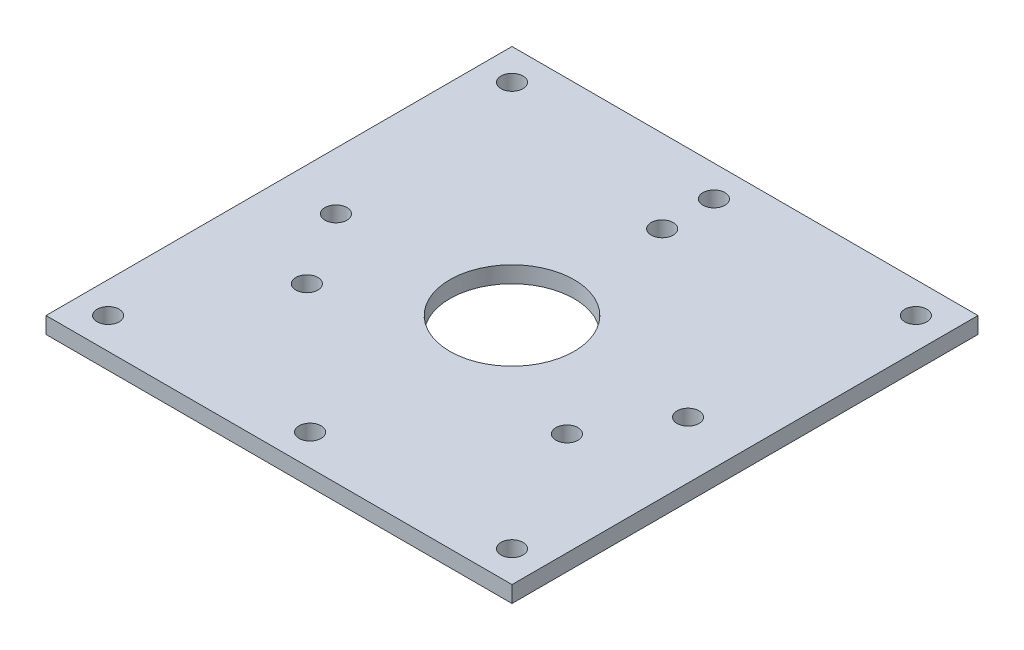
ISO-10303-21;
HEADER;
FILE_DESCRIPTION(('STEP AP214'),'2;1');
FILE_NAME('part.step','',(''),(''),'','','');
FILE_SCHEMA(('AUTOMOTIVE_DESIGN { 1 0 10303 214 1 1 1 1 }'));
ENDSEC;
DATA;
#1=APPLICATION_CONTEXT('core data for automotive mechanical design processes');
#2=APPLICATION_PROTOCOL_DEFINITION('international standard','automotive_design',2000,#1);
#3=PRODUCT_CONTEXT('',#1,'mechanical');
#4=PRODUCT('Part','Part','',(#3));
#5=PRODUCT_RELATED_PRODUCT_CATEGORY('part','',(#4));
#6=PRODUCT_DEFINITION_FORMATION('','',#4);
#7=PRODUCT_DEFINITION_CONTEXT('part definition',#1,'design');
#8=PRODUCT_DEFINITION('design','',#6,#7);
#9=PRODUCT_DEFINITION_SHAPE('','',#8);
#10=(LENGTH_UNIT() NAMED_UNIT(*) SI_UNIT(.MILLI.,.METRE.));
#11=(NAMED_UNIT(*) PLANE_ANGLE_UNIT() SI_UNIT($,.RADIAN.));
#12=(NAMED_UNIT(*) SI_UNIT($,.STERADIAN.) SOLID_ANGLE_UNIT());
#13=UNCERTAINTY_MEASURE_WITH_UNIT(LENGTH_MEASURE(1.E-05),#10,'distance_accuracy_value','');
#14=(GEOMETRIC_REPRESENTATION_CONTEXT(3) GLOBAL_UNCERTAINTY_ASSIGNED_CONTEXT((#13)) GLOBAL_UNIT_ASSIGNED_CONTEXT((#10,
#11,#12)) REPRESENTATION_CONTEXT('',''));
#15=CARTESIAN_POINT('',(0.,0.,0.));
#16=DIRECTION('',(0.,0.,1.));
#17=DIRECTION('',(1.,0.,0.));
#18=AXIS2_PLACEMENT_3D('',#15,#16,#17);
#19=CARTESIAN_POINT('',(0.,3.175,0.));
#20=DIRECTION('',(0.,-1.,0.));
#21=DIRECTION('',(0.,0.,-1.));
#22=AXIS2_PLACEMENT_3D('',#19,#20,#21);
#23=PLANE('',#22);
#24=DIRECTION('',(0.,0.,-1.));
#25=VECTOR('',#24,1.);
#26=CARTESIAN_POINT('',(45.,3.175,45.));
#27=LINE('',#26,#25);
#28=CARTESIAN_POINT('',(45.,3.175,45.));
#29=VERTEX_POINT('',#28);
#30=CARTESIAN_POINT('',(45.,3.175,-45.));
#31=VERTEX_POINT('',#30);
#32=EDGE_CURVE('E98',#29,#31,#27,.T.);
#33=ORIENTED_EDGE('',*,*,#32,.T.);
#34=DIRECTION('',(-1.,0.,0.));
#35=VECTOR('',#34,1.);
#36=CARTESIAN_POINT('',(-45.,3.175,-45.));
#37=LINE('',#36,#35);
#38=CARTESIAN_POINT('',(-45.,3.175,-45.));
#39=VERTEX_POINT('',#38);
#40=EDGE_CURVE('E93',#31,#39,#37,.T.);
#41=ORIENTED_EDGE('',*,*,#40,.T.);
#42=DIRECTION('',(0.,0.,1.));
#43=VECTOR('',#42,1.);
#44=CARTESIAN_POINT('',(-45.,3.175,45.));
#45=LINE('',#44,#43);
#46=CARTESIAN_POINT('',(-45.,3.175,45.));
#47=VERTEX_POINT('',#46);
#48=EDGE_CURVE('E96',#39,#47,#45,.T.);
#49=ORIENTED_EDGE('',*,*,#48,.T.);
#50=DIRECTION('',(1.,0.,0.));
#51=VECTOR('',#50,1.);
#52=CARTESIAN_POINT('',(-45.,3.175,45.));
#53=LINE('',#52,#51);
#54=EDGE_CURVE('E63',#47,#29,#53,.T.);
#55=ORIENTED_EDGE('',*,*,#54,.T.);
#56=EDGE_LOOP('',(#33,#41,#49,#55));
#57=FACE_BOUND('',#56,.T.);
#58=CARTESIAN_POINT('',(0.,3.175,0.));
#59=DIRECTION('',(0.,1.,0.));
#60=DIRECTION('',(0.,0.,1.));
#61=AXIS2_PLACEMENT_3D('',#58,#59,#60);
#62=CIRCLE('',#61,12.);
#63=CARTESIAN_POINT('',(0.,3.175,12.));
#64=VERTEX_POINT('',#63);
#65=EDGE_CURVE('E118',#64,#64,#62,.T.);
#66=ORIENTED_EDGE('',*,*,#65,.F.);
#67=EDGE_LOOP('',(#66));
#68=FACE_BOUND('',#67,.T.);
#69=CARTESIAN_POINT('',(0.,3.175,-29.));
#70=DIRECTION('',(0.,1.,0.));
#71=DIRECTION('',(0.,0.,1.));
#72=AXIS2_PLACEMENT_3D('',#69,#70,#71);
#73=CIRCLE('',#72,2.125);
#74=CARTESIAN_POINT('',(0.,3.175,-26.875));
#75=VERTEX_POINT('',#74);
#76=EDGE_CURVE('E140',#75,#75,#73,.T.);
#77=ORIENTED_EDGE('',*,*,#76,.F.);
#78=EDGE_LOOP('',(#77));
#79=FACE_BOUND('',#78,.T.);
#80=CARTESIAN_POINT('',(-39.,3.175,39.));
#81=DIRECTION('',(0.,1.,0.));
#82=DIRECTION('',(0.,0.,1.));
#83=AXIS2_PLACEMENT_3D('',#80,#81,#82);
#84=CIRCLE('',#83,2.125);
#85=CARTESIAN_POINT('',(-39.,3.175,41.125));
#86=VERTEX_POINT('',#85);
#87=EDGE_CURVE('E148',#86,#86,#84,.T.);
#88=ORIENTED_EDGE('',*,*,#87,.F.);
#89=EDGE_LOOP('',(#88));
#90=FACE_BOUND('',#89,.T.);
#91=CARTESIAN_POINT('',(25.1147367097506,3.175,14.4999999999989));
#92=DIRECTION('',(0.,1.,0.));
#93=DIRECTION('',(0.,0.,1.));
#94=AXIS2_PLACEMENT_3D('',#91,#92,#93);
#95=CIRCLE('',#94,2.12500000000159);
#96=CARTESIAN_POINT('',(25.1147367097506,3.175,16.6250000000005));
#97=VERTEX_POINT('',#96);
#98=EDGE_CURVE('E156',#97,#97,#95,.T.);
#99=ORIENTED_EDGE('',*,*,#98,.F.);
#100=EDGE_LOOP('',(#99));
#101=FACE_BOUND('',#100,.T.);
#102=CARTESIAN_POINT('',(-25.1147367097469,3.175,14.5000000000011));
#103=DIRECTION('',(0.,1.,0.));
#104=DIRECTION('',(0.,0.,1.));
#105=AXIS2_PLACEMENT_3D('',#102,#103,#104);
#106=CIRCLE('',#105,2.12500000000233);
#107=CARTESIAN_POINT('',(-25.1147367097469,3.175,16.6250000000034));
#108=VERTEX_POINT('',#107);
#109=EDGE_CURVE('E164',#108,#108,#106,.T.);
#110=ORIENTED_EDGE('',*,*,#109,.F.);
#111=EDGE_LOOP('',(#110));
#112=FACE_BOUND('',#111,.T.);
#113=CARTESIAN_POINT('',(-34.,3.175,0.));
#114=DIRECTION('',(0.,1.,0.));
#115=DIRECTION('',(0.,0.,1.));
#116=AXIS2_PLACEMENT_3D('',#113,#114,#115);
#117=CIRCLE('',#116,2.125);
#118=CARTESIAN_POINT('',(-34.,3.175,2.125));
#119=VERTEX_POINT('',#118);
#120=EDGE_CURVE('E172',#119,#119,#117,.T.);
#121=ORIENTED_EDGE('',*,*,#120,.F.);
#122=EDGE_LOOP('',(#121));
#123=FACE_BOUND('',#122,.T.);
#124=CARTESIAN_POINT('',(-39.,3.175,-39.));
#125=DIRECTION('',(0.,1.,0.));
#126=DIRECTION('',(0.,0.,-1.));
#127=AXIS2_PLACEMENT_3D('',#124,#125,#126);
#128=CIRCLE('',#127,2.125);
#129=CARTESIAN_POINT('',(-39.,3.175,-41.125));
#130=VERTEX_POINT('',#129);
#131=EDGE_CURVE('E180',#130,#130,#128,.T.);
#132=ORIENTED_EDGE('',*,*,#131,.F.);
#133=EDGE_LOOP('',(#132));
#134=FACE_BOUND('',#133,.T.);
#135=CARTESIAN_POINT('',(39.,3.175,39.));
#136=DIRECTION('',(0.,1.,0.));
#137=DIRECTION('',(0.,0.,-1.));
#138=AXIS2_PLACEMENT_3D('',#135,#136,#137);
#139=CIRCLE('',#138,2.125);
#140=CARTESIAN_POINT('',(39.,3.175,36.875));
#141=VERTEX_POINT('',#140);
#142=EDGE_CURVE('E188',#141,#141,#139,.T.);
#143=ORIENTED_EDGE('',*,*,#142,.F.);
#144=EDGE_LOOP('',(#143));
#145=FACE_BOUND('',#144,.T.);
#146=CARTESIAN_POINT('',(34.,3.175,0.));
#147=DIRECTION('',(0.,1.,0.));
#148=DIRECTION('',(0.,0.,-1.));
#149=AXIS2_PLACEMENT_3D('',#146,#147,#148);
#150=CIRCLE('',#149,2.125);
#151=CARTESIAN_POINT('',(34.,3.175,-2.125));
#152=VERTEX_POINT('',#151);
#153=EDGE_CURVE('E196',#152,#152,#150,.T.);
#154=ORIENTED_EDGE('',*,*,#153,.F.);
#155=EDGE_LOOP('',(#154));
#156=FACE_BOUND('',#155,.T.);
#157=CARTESIAN_POINT('',(39.,3.175,-39.));
#158=DIRECTION('',(0.,1.,0.));
#159=DIRECTION('',(0.,0.,1.));
#160=AXIS2_PLACEMENT_3D('',#157,#158,#159);
#161=CIRCLE('',#160,2.125);
#162=CARTESIAN_POINT('',(39.,3.175,-36.875));
#163=VERTEX_POINT('',#162);
#164=EDGE_CURVE('E204',#163,#163,#161,.T.);
#165=ORIENTED_EDGE('',*,*,#164,.F.);
#166=EDGE_LOOP('',(#165));
#167=FACE_BOUND('',#166,.T.);
#168=CARTESIAN_POINT('',(0.,3.175,39.));
#169=DIRECTION('',(0.,1.,0.));
#170=DIRECTION('',(0.,0.,1.));
#171=AXIS2_PLACEMENT_3D('',#168,#169,#170);
#172=CIRCLE('',#171,2.125);
#173=CARTESIAN_POINT('',(0.,3.175,41.125));
#174=VERTEX_POINT('',#173);
#175=EDGE_CURVE('E212',#174,#174,#172,.T.);
#176=ORIENTED_EDGE('',*,*,#175,.F.);
#177=EDGE_LOOP('',(#176));
#178=FACE_BOUND('',#177,.T.);
#179=CARTESIAN_POINT('',(0.,3.175,-39.));
#180=DIRECTION('',(0.,1.,0.));
#181=DIRECTION('',(0.,0.,-1.));
#182=AXIS2_PLACEMENT_3D('',#179,#180,#181);
#183=CIRCLE('',#182,2.125);
#184=CARTESIAN_POINT('',(0.,3.175,-41.125));
#185=VERTEX_POINT('',#184);
#186=EDGE_CURVE('E220',#185,#185,#183,.T.);
#187=ORIENTED_EDGE('',*,*,#186,.F.);
#188=EDGE_LOOP('',(#187));
#189=FACE_BOUND('',#188,.T.);
#190=ADVANCED_FACE('F45',(#57,#68,#79,#90,#101,#112,#123,#134,#145,#156,#167,#178,#189),#23,.F.);
#191=CARTESIAN_POINT('',(0.,0.,0.));
#192=DIRECTION('',(0.,-1.,0.));
#193=DIRECTION('',(0.,0.,-1.));
#194=AXIS2_PLACEMENT_3D('',#191,#192,#193);
#195=PLANE('',#194);
#196=CARTESIAN_POINT('',(0.,0.,39.));
#197=DIRECTION('',(0.,1.,0.));
#198=DIRECTION('',(0.,0.,1.));
#199=AXIS2_PLACEMENT_3D('',#196,#197,#198);
#200=CIRCLE('',#199,2.125);
#201=CARTESIAN_POINT('',(0.,0.,41.125));
#202=VERTEX_POINT('',#201);
#203=EDGE_CURVE('E216',#202,#202,#200,.T.);
#204=ORIENTED_EDGE('',*,*,#203,.T.);
#205=EDGE_LOOP('',(#204));
#206=FACE_BOUND('',#205,.T.);
#207=CARTESIAN_POINT('',(34.,0.,0.));
#208=DIRECTION('',(0.,1.,0.));
#209=DIRECTION('',(0.,0.,-1.));
#210=AXIS2_PLACEMENT_3D('',#207,#208,#209);
#211=CIRCLE('',#210,2.125);
#212=CARTESIAN_POINT('',(34.,0.,-2.125));
#213=VERTEX_POINT('',#212);
#214=EDGE_CURVE('E200',#213,#213,#211,.T.);
#215=ORIENTED_EDGE('',*,*,#214,.T.);
#216=EDGE_LOOP('',(#215));
#217=FACE_BOUND('',#216,.T.);
#218=CARTESIAN_POINT('',(-39.,0.,-39.));
#219=DIRECTION('',(0.,1.,0.));
#220=DIRECTION('',(0.,0.,-1.));
#221=AXIS2_PLACEMENT_3D('',#218,#219,#220);
#222=CIRCLE('',#221,2.125);
#223=CARTESIAN_POINT('',(-39.,0.,-41.125));
#224=VERTEX_POINT('',#223);
#225=EDGE_CURVE('E184',#224,#224,#222,.T.);
#226=ORIENTED_EDGE('',*,*,#225,.T.);
#227=EDGE_LOOP('',(#226));
#228=FACE_BOUND('',#227,.T.);
#229=CARTESIAN_POINT('',(-25.1147367097469,0.,14.5000000000011));
#230=DIRECTION('',(0.,1.,0.));
#231=DIRECTION('',(0.,0.,1.));
#232=AXIS2_PLACEMENT_3D('',#229,#230,#231);
#233=CIRCLE('',#232,2.12500000000233);
#234=CARTESIAN_POINT('',(-25.1147367097469,0.,16.6250000000034));
#235=VERTEX_POINT('',#234);
#236=EDGE_CURVE('E168',#235,#235,#233,.T.);
#237=ORIENTED_EDGE('',*,*,#236,.T.);
#238=EDGE_LOOP('',(#237));
#239=FACE_BOUND('',#238,.T.);
#240=CARTESIAN_POINT('',(-39.,0.,39.));
#241=DIRECTION('',(0.,1.,0.));
#242=DIRECTION('',(0.,0.,1.));
#243=AXIS2_PLACEMENT_3D('',#240,#241,#242);
#244=CIRCLE('',#243,2.125);
#245=CARTESIAN_POINT('',(-39.,0.,41.125));
#246=VERTEX_POINT('',#245);
#247=EDGE_CURVE('E152',#246,#246,#244,.T.);
#248=ORIENTED_EDGE('',*,*,#247,.T.);
#249=EDGE_LOOP('',(#248));
#250=FACE_BOUND('',#249,.T.);
#251=CARTESIAN_POINT('',(0.,0.,0.));
#252=DIRECTION('',(0.,1.,0.));
#253=DIRECTION('',(0.,0.,1.));
#254=AXIS2_PLACEMENT_3D('',#251,#252,#253);
#255=CIRCLE('',#254,12.);
#256=CARTESIAN_POINT('',(0.,0.,12.));
#257=VERTEX_POINT('',#256);
#258=EDGE_CURVE('E136',#257,#257,#255,.T.);
#259=ORIENTED_EDGE('',*,*,#258,.T.);
#260=EDGE_LOOP('',(#259));
#261=FACE_BOUND('',#260,.T.);
#262=DIRECTION('',(0.,0.,-1.));
#263=VECTOR('',#262,1.);
#264=CARTESIAN_POINT('',(45.,0.,45.));
#265=LINE('',#264,#263);
#266=CARTESIAN_POINT('',(45.,0.,45.));
#267=VERTEX_POINT('',#266);
#268=CARTESIAN_POINT('',(45.,0.,-45.));
#269=VERTEX_POINT('',#268);
#270=EDGE_CURVE('E114',#267,#269,#265,.T.);
#271=ORIENTED_EDGE('',*,*,#270,.F.);
#272=DIRECTION('',(1.,0.,0.));
#273=VECTOR('',#272,1.);
#274=CARTESIAN_POINT('',(-45.,0.,45.));
#275=LINE('',#274,#273);
#276=CARTESIAN_POINT('',(-45.,0.,45.));
#277=VERTEX_POINT('',#276);
#278=EDGE_CURVE('E86',#277,#267,#275,.T.);
#279=ORIENTED_EDGE('',*,*,#278,.F.);
#280=DIRECTION('',(0.,0.,1.));
#281=VECTOR('',#280,1.);
#282=CARTESIAN_POINT('',(-45.,0.,45.));
#283=LINE('',#282,#281);
#284=CARTESIAN_POINT('',(-45.,0.,-45.));
#285=VERTEX_POINT('',#284);
#286=EDGE_CURVE('E80',#285,#277,#283,.T.);
#287=ORIENTED_EDGE('',*,*,#286,.F.);
#288=DIRECTION('',(-1.,0.,0.));
#289=VECTOR('',#288,1.);
#290=CARTESIAN_POINT('',(-45.,0.,-45.));
#291=LINE('',#290,#289);
#292=EDGE_CURVE('E103',#269,#285,#291,.T.);
#293=ORIENTED_EDGE('',*,*,#292,.F.);
#294=EDGE_LOOP('',(#271,#279,#287,#293));
#295=FACE_BOUND('',#294,.T.);
#296=CARTESIAN_POINT('',(0.,0.,-29.));
#297=DIRECTION('',(0.,1.,0.));
#298=DIRECTION('',(0.,0.,1.));
#299=AXIS2_PLACEMENT_3D('',#296,#297,#298);
#300=CIRCLE('',#299,2.125);
#301=CARTESIAN_POINT('',(0.,0.,-26.875));
#302=VERTEX_POINT('',#301);
#303=EDGE_CURVE('E144',#302,#302,#300,.T.);
#304=ORIENTED_EDGE('',*,*,#303,.T.);
#305=EDGE_LOOP('',(#304));
#306=FACE_BOUND('',#305,.T.);
#307=CARTESIAN_POINT('',(25.1147367097506,0.,14.4999999999989));
#308=DIRECTION('',(0.,1.,0.));
#309=DIRECTION('',(0.,0.,1.));
#310=AXIS2_PLACEMENT_3D('',#307,#308,#309);
#311=CIRCLE('',#310,2.12500000000159);
#312=CARTESIAN_POINT('',(25.1147367097506,0.,16.6250000000005));
#313=VERTEX_POINT('',#312);
#314=EDGE_CURVE('E160',#313,#313,#311,.T.);
#315=ORIENTED_EDGE('',*,*,#314,.T.);
#316=EDGE_LOOP('',(#315));
#317=FACE_BOUND('',#316,.T.);
#318=CARTESIAN_POINT('',(-34.,0.,0.));
#319=DIRECTION('',(0.,1.,0.));
#320=DIRECTION('',(0.,0.,1.));
#321=AXIS2_PLACEMENT_3D('',#318,#319,#320);
#322=CIRCLE('',#321,2.125);
#323=CARTESIAN_POINT('',(-34.,0.,2.125));
#324=VERTEX_POINT('',#323);
#325=EDGE_CURVE('E176',#324,#324,#322,.T.);
#326=ORIENTED_EDGE('',*,*,#325,.T.);
#327=EDGE_LOOP('',(#326));
#328=FACE_BOUND('',#327,.T.);
#329=CARTESIAN_POINT('',(39.,0.,39.));
#330=DIRECTION('',(0.,1.,0.));
#331=DIRECTION('',(0.,0.,-1.));
#332=AXIS2_PLACEMENT_3D('',#329,#330,#331);
#333=CIRCLE('',#332,2.125);
#334=CARTESIAN_POINT('',(39.,0.,36.875));
#335=VERTEX_POINT('',#334);
#336=EDGE_CURVE('E192',#335,#335,#333,.T.);
#337=ORIENTED_EDGE('',*,*,#336,.T.);
#338=EDGE_LOOP('',(#337));
#339=FACE_BOUND('',#338,.T.);
#340=CARTESIAN_POINT('',(39.,0.,-39.));
#341=DIRECTION('',(0.,1.,0.));
#342=DIRECTION('',(0.,0.,1.));
#343=AXIS2_PLACEMENT_3D('',#340,#341,#342);
#344=CIRCLE('',#343,2.125);
#345=CARTESIAN_POINT('',(39.,0.,-36.875));
#346=VERTEX_POINT('',#345);
#347=EDGE_CURVE('E208',#346,#346,#344,.T.);
#348=ORIENTED_EDGE('',*,*,#347,.T.);
#349=EDGE_LOOP('',(#348));
#350=FACE_BOUND('',#349,.T.);
#351=CARTESIAN_POINT('',(0.,0.,-39.));
#352=DIRECTION('',(0.,1.,0.));
#353=DIRECTION('',(0.,0.,-1.));
#354=AXIS2_PLACEMENT_3D('',#351,#352,#353);
#355=CIRCLE('',#354,2.125);
#356=CARTESIAN_POINT('',(0.,0.,-41.125));
#357=VERTEX_POINT('',#356);
#358=EDGE_CURVE('E224',#357,#357,#355,.T.);
#359=ORIENTED_EDGE('',*,*,#358,.T.);
#360=EDGE_LOOP('',(#359));
#361=FACE_BOUND('',#360,.T.);
#362=ADVANCED_FACE('F131',(#206,#217,#228,#239,#250,#261,#295,#306,#317,#328,#339,#350,#361),
#195,.T.);
#363=CARTESIAN_POINT('',(45.,3.175,45.));
#364=DIRECTION('',(-1.,0.,0.));
#365=DIRECTION('',(0.,0.,1.));
#366=AXIS2_PLACEMENT_3D('',#363,#364,#365);
#367=PLANE('',#366);
#368=ORIENTED_EDGE('',*,*,#270,.T.);
#369=DIRECTION('',(0.,-1.,0.));
#370=VECTOR('',#369,1.);
#371=CARTESIAN_POINT('',(45.,3.175,-45.));
#372=LINE('',#371,#370);
#373=EDGE_CURVE('E11',#31,#269,#372,.T.);
#374=ORIENTED_EDGE('',*,*,#373,.F.);
#375=ORIENTED_EDGE('',*,*,#32,.F.);
#376=DIRECTION('',(0.,-1.,0.));
#377=VECTOR('',#376,1.);
#378=CARTESIAN_POINT('',(45.,3.175,45.));
#379=LINE('',#378,#377);
#380=EDGE_CURVE('E110',#29,#267,#379,.T.);
#381=ORIENTED_EDGE('',*,*,#380,.T.);
#382=EDGE_LOOP('',(#368,#374,#375,#381));
#383=FACE_BOUND('',#382,.T.);
#384=ADVANCED_FACE('F47',(#383),#367,.F.);
#385=CARTESIAN_POINT('',(-45.,3.175,-45.));
#386=DIRECTION('',(0.,0.,1.));
#387=DIRECTION('',(1.,0.,0.));
#388=AXIS2_PLACEMENT_3D('',#385,#386,#387);
#389=PLANE('',#388);
#390=ORIENTED_EDGE('',*,*,#292,.T.);
#391=DIRECTION('',(0.,-1.,0.));
#392=VECTOR('',#391,1.);
#393=CARTESIAN_POINT('',(-45.,3.175,-45.));
#394=LINE('',#393,#392);
#395=EDGE_CURVE('E55',#39,#285,#394,.T.);
#396=ORIENTED_EDGE('',*,*,#395,.F.);
#397=ORIENTED_EDGE('',*,*,#40,.F.);
#398=ORIENTED_EDGE('',*,*,#373,.T.);
#399=EDGE_LOOP('',(#390,#396,#397,#398));
#400=FACE_BOUND('',#399,.T.);
#401=ADVANCED_FACE('F102',(#400),#389,.F.);
#402=CARTESIAN_POINT('',(-45.,3.175,45.));
#403=DIRECTION('',(1.,0.,0.));
#404=DIRECTION('',(0.,0.,-1.));
#405=AXIS2_PLACEMENT_3D('',#402,#403,#404);
#406=PLANE('',#405);
#407=ORIENTED_EDGE('',*,*,#286,.T.);
#408=DIRECTION('',(0.,-1.,0.));
#409=VECTOR('',#408,1.);
#410=CARTESIAN_POINT('',(-45.,3.175,45.));
#411=LINE('',#410,#409);
#412=EDGE_CURVE('E105',#47,#277,#411,.T.);
#413=ORIENTED_EDGE('',*,*,#412,.F.);
#414=ORIENTED_EDGE('',*,*,#48,.F.);
#415=ORIENTED_EDGE('',*,*,#395,.T.);
#416=EDGE_LOOP('',(#407,#413,#414,#415));
#417=FACE_BOUND('',#416,.T.);
#418=ADVANCED_FACE('F106',(#417),#406,.F.);
#419=CARTESIAN_POINT('',(-45.,3.175,45.));
#420=DIRECTION('',(0.,0.,-1.));
#421=DIRECTION('',(-1.,0.,0.));
#422=AXIS2_PLACEMENT_3D('',#419,#420,#421);
#423=PLANE('',#422);
#424=ORIENTED_EDGE('',*,*,#278,.T.);
#425=ORIENTED_EDGE('',*,*,#380,.F.);
#426=ORIENTED_EDGE('',*,*,#54,.F.);
#427=ORIENTED_EDGE('',*,*,#412,.T.);
#428=EDGE_LOOP('',(#424,#425,#426,#427));
#429=FACE_BOUND('',#428,.T.);
#430=ADVANCED_FACE('F128',(#429),#423,.F.);
#431=CARTESIAN_POINT('',(0.,3.175,0.));
#432=DIRECTION('',(0.,-1.,0.));
#433=DIRECTION('',(0.,0.,-1.));
#434=AXIS2_PLACEMENT_3D('',#431,#432,#433);
#435=CYLINDRICAL_SURFACE('',#434,12.);
#436=ORIENTED_EDGE('',*,*,#65,.T.);
#437=EDGE_LOOP('',(#436));
#438=FACE_BOUND('',#437,.T.);
#439=ORIENTED_EDGE('',*,*,#258,.F.);
#440=EDGE_LOOP('',(#439));
#441=FACE_BOUND('',#440,.T.);
#442=ADVANCED_FACE('F243',(#438,#441),#435,.F.);
#443=CARTESIAN_POINT('',(0.,3.175,-29.));
#444=DIRECTION('',(0.,-1.,0.));
#445=DIRECTION('',(0.,0.,-1.));
#446=AXIS2_PLACEMENT_3D('',#443,#444,#445);
#447=CYLINDRICAL_SURFACE('',#446,2.125);
#448=ORIENTED_EDGE('',*,*,#76,.T.);
#449=EDGE_LOOP('',(#448));
#450=FACE_BOUND('',#449,.T.);
#451=ORIENTED_EDGE('',*,*,#303,.F.);
#452=EDGE_LOOP('',(#451));
#453=FACE_BOUND('',#452,.T.);
#454=ADVANCED_FACE('F288',(#450,#453),#447,.F.);
#455=CARTESIAN_POINT('',(-39.,3.175,39.));
#456=DIRECTION('',(0.,-1.,0.));
#457=DIRECTION('',(0.,0.,-1.));
#458=AXIS2_PLACEMENT_3D('',#455,#456,#457);
#459=CYLINDRICAL_SURFACE('',#458,2.125);
#460=ORIENTED_EDGE('',*,*,#87,.T.);
#461=EDGE_LOOP('',(#460));
#462=FACE_BOUND('',#461,.T.);
#463=ORIENTED_EDGE('',*,*,#247,.F.);
#464=EDGE_LOOP('',(#463));
#465=FACE_BOUND('',#464,.T.);
#466=ADVANCED_FACE('F296',(#462,#465),#459,.F.);
#467=CARTESIAN_POINT('',(25.1147367097506,3.175,14.4999999999989));
#468=DIRECTION('',(0.,-1.,0.));
#469=DIRECTION('',(0.,0.,-1.));
#470=AXIS2_PLACEMENT_3D('',#467,#468,#469);
#471=CYLINDRICAL_SURFACE('',#470,2.12500000000159);
#472=ORIENTED_EDGE('',*,*,#98,.T.);
#473=EDGE_LOOP('',(#472));
#474=FACE_BOUND('',#473,.T.);
#475=ORIENTED_EDGE('',*,*,#314,.F.);
#476=EDGE_LOOP('',(#475));
#477=FACE_BOUND('',#476,.T.);
#478=ADVANCED_FACE('F304',(#474,#477),#471,.F.);
#479=CARTESIAN_POINT('',(-25.1147367097469,3.175,14.5000000000011));
#480=DIRECTION('',(0.,-1.,0.));
#481=DIRECTION('',(0.,0.,-1.));
#482=AXIS2_PLACEMENT_3D('',#479,#480,#481);
#483=CYLINDRICAL_SURFACE('',#482,2.12500000000233);
#484=ORIENTED_EDGE('',*,*,#109,.T.);
#485=EDGE_LOOP('',(#484));
#486=FACE_BOUND('',#485,.T.);
#487=ORIENTED_EDGE('',*,*,#236,.F.);
#488=EDGE_LOOP('',(#487));
#489=FACE_BOUND('',#488,.T.);
#490=ADVANCED_FACE('F313',(#486,#489),#483,.F.);
#491=CARTESIAN_POINT('',(-34.,3.175,0.));
#492=DIRECTION('',(0.,-1.,0.));
#493=DIRECTION('',(0.,0.,-1.));
#494=AXIS2_PLACEMENT_3D('',#491,#492,#493);
#495=CYLINDRICAL_SURFACE('',#494,2.125);
#496=ORIENTED_EDGE('',*,*,#120,.T.);
#497=EDGE_LOOP('',(#496));
#498=FACE_BOUND('',#497,.T.);
#499=ORIENTED_EDGE('',*,*,#325,.F.);
#500=EDGE_LOOP('',(#499));
#501=FACE_BOUND('',#500,.T.);
#502=ADVANCED_FACE('F322',(#498,#501),#495,.F.);
#503=CARTESIAN_POINT('',(-39.,3.175,-39.));
#504=DIRECTION('',(0.,-1.,0.));
#505=DIRECTION('',(0.,0.,-1.));
#506=AXIS2_PLACEMENT_3D('',#503,#504,#505);
#507=CYLINDRICAL_SURFACE('',#506,2.125);
#508=ORIENTED_EDGE('',*,*,#131,.T.);
#509=EDGE_LOOP('',(#508));
#510=FACE_BOUND('',#509,.T.);
#511=ORIENTED_EDGE('',*,*,#225,.F.);
#512=EDGE_LOOP('',(#511));
#513=FACE_BOUND('',#512,.T.);
#514=ADVANCED_FACE('F331',(#510,#513),#507,.F.);
#515=CARTESIAN_POINT('',(39.,3.175,39.));
#516=DIRECTION('',(0.,-1.,0.));
#517=DIRECTION('',(0.,0.,-1.));
#518=AXIS2_PLACEMENT_3D('',#515,#516,#517);
#519=CYLINDRICAL_SURFACE('',#518,2.125);
#520=ORIENTED_EDGE('',*,*,#142,.T.);
#521=EDGE_LOOP('',(#520));
#522=FACE_BOUND('',#521,.T.);
#523=ORIENTED_EDGE('',*,*,#336,.F.);
#524=EDGE_LOOP('',(#523));
#525=FACE_BOUND('',#524,.T.);
#526=ADVANCED_FACE('F340',(#522,#525),#519,.F.);
#527=CARTESIAN_POINT('',(34.,3.175,0.));
#528=DIRECTION('',(0.,-1.,0.));
#529=DIRECTION('',(0.,0.,-1.));
#530=AXIS2_PLACEMENT_3D('',#527,#528,#529);
#531=CYLINDRICAL_SURFACE('',#530,2.125);
#532=ORIENTED_EDGE('',*,*,#153,.T.);
#533=EDGE_LOOP('',(#532));
#534=FACE_BOUND('',#533,.T.);
#535=ORIENTED_EDGE('',*,*,#214,.F.);
#536=EDGE_LOOP('',(#535));
#537=FACE_BOUND('',#536,.T.);
#538=ADVANCED_FACE('F349',(#534,#537),#531,.F.);
#539=CARTESIAN_POINT('',(39.,3.175,-39.));
#540=DIRECTION('',(0.,-1.,0.));
#541=DIRECTION('',(0.,0.,-1.));
#542=AXIS2_PLACEMENT_3D('',#539,#540,#541);
#543=CYLINDRICAL_SURFACE('',#542,2.125);
#544=ORIENTED_EDGE('',*,*,#164,.T.);
#545=EDGE_LOOP('',(#544));
#546=FACE_BOUND('',#545,.T.);
#547=ORIENTED_EDGE('',*,*,#347,.F.);
#548=EDGE_LOOP('',(#547));
#549=FACE_BOUND('',#548,.T.);
#550=ADVANCED_FACE('F358',(#546,#549),#543,.F.);
#551=CARTESIAN_POINT('',(0.,3.175,39.));
#552=DIRECTION('',(0.,-1.,0.));
#553=DIRECTION('',(0.,0.,-1.));
#554=AXIS2_PLACEMENT_3D('',#551,#552,#553);
#555=CYLINDRICAL_SURFACE('',#554,2.125);
#556=ORIENTED_EDGE('',*,*,#175,.T.);
#557=EDGE_LOOP('',(#556));
#558=FACE_BOUND('',#557,.T.);
#559=ORIENTED_EDGE('',*,*,#203,.F.);
#560=EDGE_LOOP('',(#559));
#561=FACE_BOUND('',#560,.T.);
#562=ADVANCED_FACE('F367',(#558,#561),#555,.F.);
#563=CARTESIAN_POINT('',(0.,3.175,-39.));
#564=DIRECTION('',(0.,-1.,0.));
#565=DIRECTION('',(0.,0.,-1.));
#566=AXIS2_PLACEMENT_3D('',#563,#564,#565);
#567=CYLINDRICAL_SURFACE('',#566,2.125);
#568=ORIENTED_EDGE('',*,*,#186,.T.);
#569=EDGE_LOOP('',(#568));
#570=FACE_BOUND('',#569,.T.);
#571=ORIENTED_EDGE('',*,*,#358,.F.);
#572=EDGE_LOOP('',(#571));
#573=FACE_BOUND('',#572,.T.);
#574=ADVANCED_FACE('F232',(#570,#573),#567,.F.);
#575=CLOSED_SHELL('',(#190,#362,#384,#401,#418,#430,#442,#454,#466,#478,#490,#502,#514,#526,
#538,#550,#562,#574));
#576=MANIFOLD_SOLID_BREP('B2',#575);
#577=ADVANCED_BREP_SHAPE_REPRESENTATION('',(#18,#576),#14);
#578=SHAPE_DEFINITION_REPRESENTATION(#9,#577);
ENDSEC;
END-ISO-10303-21;
